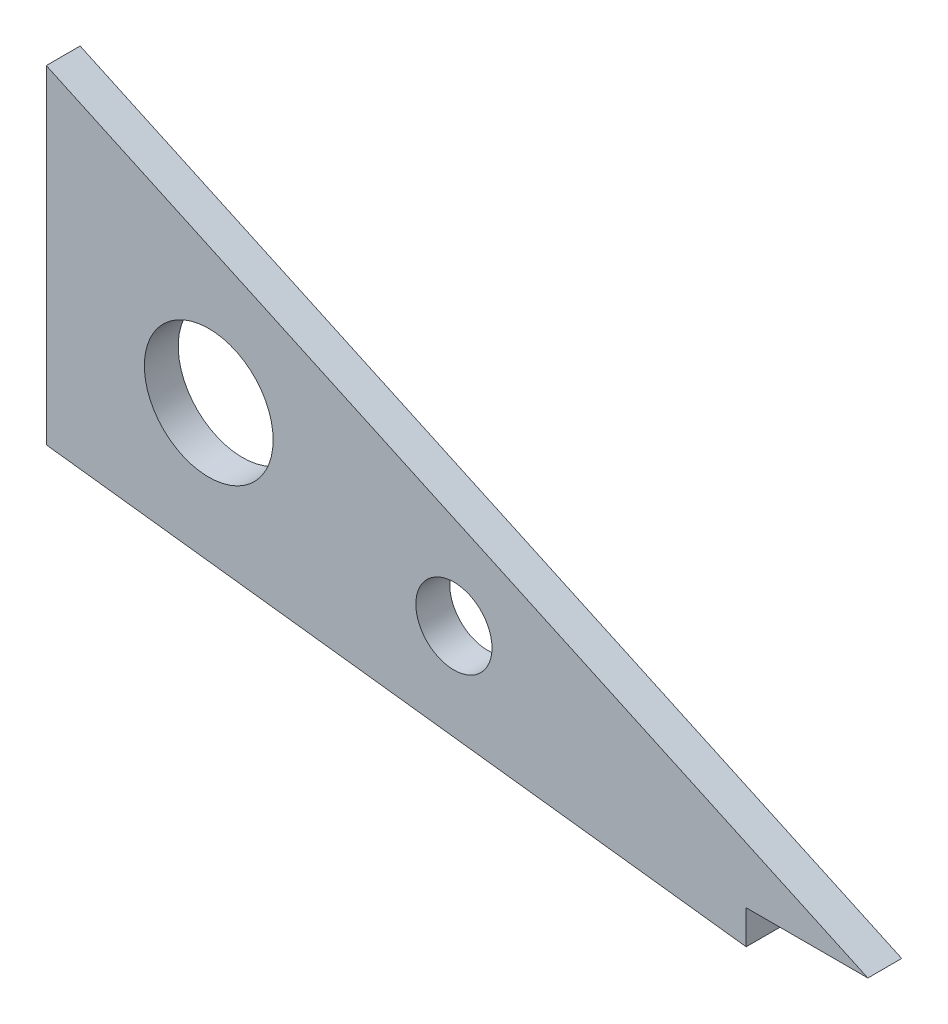
ISO-10303-21;
HEADER;
FILE_DESCRIPTION(('STEP AP214'),'2;1');
FILE_NAME('part.step','',(''),(''),'','','');
FILE_SCHEMA(('AUTOMOTIVE_DESIGN { 1 0 10303 214 1 1 1 1 }'));
ENDSEC;
DATA;
#1=APPLICATION_CONTEXT('core data for automotive mechanical design processes');
#2=APPLICATION_PROTOCOL_DEFINITION('international standard','automotive_design',2000,#1);
#3=PRODUCT_CONTEXT('',#1,'mechanical');
#4=PRODUCT('Part','Part','',(#3));
#5=PRODUCT_RELATED_PRODUCT_CATEGORY('part','',(#4));
#6=PRODUCT_DEFINITION_FORMATION('','',#4);
#7=PRODUCT_DEFINITION_CONTEXT('part definition',#1,'design');
#8=PRODUCT_DEFINITION('design','',#6,#7);
#9=PRODUCT_DEFINITION_SHAPE('','',#8);
#10=(LENGTH_UNIT() NAMED_UNIT(*) SI_UNIT(.MILLI.,.METRE.));
#11=(NAMED_UNIT(*) PLANE_ANGLE_UNIT() SI_UNIT($,.RADIAN.));
#12=(NAMED_UNIT(*) SI_UNIT($,.STERADIAN.) SOLID_ANGLE_UNIT());
#13=UNCERTAINTY_MEASURE_WITH_UNIT(LENGTH_MEASURE(1.E-05),#10,'distance_accuracy_value','');
#14=(GEOMETRIC_REPRESENTATION_CONTEXT(3) GLOBAL_UNCERTAINTY_ASSIGNED_CONTEXT((#13)) GLOBAL_UNIT_ASSIGNED_CONTEXT((#10,
#11,#12)) REPRESENTATION_CONTEXT('',''));
#15=CARTESIAN_POINT('',(0.,0.,0.));
#16=DIRECTION('',(0.,0.,1.));
#17=DIRECTION('',(1.,0.,0.));
#18=AXIS2_PLACEMENT_3D('',#15,#16,#17);
#19=CARTESIAN_POINT('',(0.,0.,2.));
#20=DIRECTION('',(0.,0.,1.));
#21=DIRECTION('',(1.,0.,0.));
#22=AXIS2_PLACEMENT_3D('',#19,#20,#21);
#23=PLANE('',#22);
#24=CARTESIAN_POINT('',(27.9785551008086,22.9070632910188,2.));
#25=DIRECTION('',(0.,0.,1.));
#26=DIRECTION('',(1.,0.,0.));
#27=AXIS2_PLACEMENT_3D('',#24,#25,#26);
#28=CIRCLE('',#27,3.804230181389);
#29=CARTESIAN_POINT('',(31.7827852821976,22.9070632910188,2.));
#30=VERTEX_POINT('',#29);
#31=EDGE_CURVE('E112',#30,#30,#28,.T.);
#32=ORIENTED_EDGE('',*,*,#31,.F.);
#33=EDGE_LOOP('',(#32));
#34=FACE_BOUND('',#33,.T.);
#35=DIRECTION('',(-0.907866673838739,0.419258992190965,0.));
#36=VECTOR('',#35,1.);
#37=CARTESIAN_POINT('',(18.3812223177325,35.3625936058513,2.));
#38=LINE('',#37,#36);
#39=CARTESIAN_POINT('',(66.9125575060626,12.9504936058513,2.));
#40=VERTEX_POINT('',#39);
#41=CARTESIAN_POINT('',(18.3812223177325,35.3625936058513,2.));
#42=VERTEX_POINT('',#41);
#43=EDGE_CURVE('E117',#40,#42,#38,.T.);
#44=ORIENTED_EDGE('',*,*,#43,.T.);
#45=DIRECTION('',(0.,-1.,0.));
#46=VECTOR('',#45,1.);
#47=CARTESIAN_POINT('',(18.3812223177325,35.3625936058513,2.));
#48=LINE('',#47,#46);
#49=CARTESIAN_POINT('',(18.3812223177325,15.9598936058514,2.));
#50=VERTEX_POINT('',#49);
#51=EDGE_CURVE('E84',#42,#50,#48,.T.);
#52=ORIENTED_EDGE('',*,*,#51,.T.);
#53=DIRECTION('',(0.992738748127803,-0.120290390163317,0.));
#54=VECTOR('',#53,1.);
#55=CARTESIAN_POINT('',(18.3812223177325,15.9598936058514,2.));
#56=LINE('',#55,#54);
#57=CARTESIAN_POINT('',(59.7230575060636,10.9504936058509,2.));
#58=VERTEX_POINT('',#57);
#59=EDGE_CURVE('E88',#50,#58,#56,.T.);
#60=ORIENTED_EDGE('',*,*,#59,.T.);
#61=DIRECTION('',(0.,1.,0.));
#62=VECTOR('',#61,1.);
#63=CARTESIAN_POINT('',(59.7230575060636,10.9504936058509,2.));
#64=LINE('',#63,#62);
#65=CARTESIAN_POINT('',(59.7230575060636,12.9504936058513,2.));
#66=VERTEX_POINT('',#65);
#67=EDGE_CURVE('E92',#58,#66,#64,.T.);
#68=ORIENTED_EDGE('',*,*,#67,.T.);
#69=DIRECTION('',(1.,0.,0.));
#70=VECTOR('',#69,1.);
#71=CARTESIAN_POINT('',(59.7230575060636,12.9504936058513,2.));
#72=LINE('',#71,#70);
#73=EDGE_CURVE('E50',#66,#40,#72,.T.);
#74=ORIENTED_EDGE('',*,*,#73,.T.);
#75=EDGE_LOOP('',(#44,#52,#60,#68,#74));
#76=FACE_BOUND('',#75,.T.);
#77=CARTESIAN_POINT('',(42.4602729016075,18.7298037894143,2.));
#78=DIRECTION('',(0.,0.,1.));
#79=DIRECTION('',(1.,0.,0.));
#80=AXIS2_PLACEMENT_3D('',#77,#78,#79);
#81=CIRCLE('',#80,2.24992563442071);
#82=CARTESIAN_POINT('',(44.7101985360282,18.7298037894143,2.));
#83=VERTEX_POINT('',#82);
#84=EDGE_CURVE('E154',#83,#83,#81,.T.);
#85=ORIENTED_EDGE('',*,*,#84,.F.);
#86=EDGE_LOOP('',(#85));
#87=FACE_BOUND('',#86,.T.);
#88=ADVANCED_FACE('F33',(#34,#76,#87),#23,.T.);
#89=CARTESIAN_POINT('',(0.,0.,0.));
#90=DIRECTION('',(0.,0.,1.));
#91=DIRECTION('',(1.,0.,0.));
#92=AXIS2_PLACEMENT_3D('',#89,#90,#91);
#93=PLANE('',#92);
#94=DIRECTION('',(-0.907866673838739,0.419258992190965,0.));
#95=VECTOR('',#94,1.);
#96=CARTESIAN_POINT('',(18.3812223177325,35.3625936058513,0.));
#97=LINE('',#96,#95);
#98=CARTESIAN_POINT('',(66.9125575060626,12.9504936058513,0.));
#99=VERTEX_POINT('',#98);
#100=CARTESIAN_POINT('',(18.3812223177325,35.3625936058513,0.));
#101=VERTEX_POINT('',#100);
#102=EDGE_CURVE('E108',#99,#101,#97,.T.);
#103=ORIENTED_EDGE('',*,*,#102,.F.);
#104=DIRECTION('',(1.,0.,0.));
#105=VECTOR('',#104,1.);
#106=CARTESIAN_POINT('',(59.7230575060636,12.9504936058513,0.));
#107=LINE('',#106,#105);
#108=CARTESIAN_POINT('',(59.7230575060636,12.9504936058513,0.));
#109=VERTEX_POINT('',#108);
#110=EDGE_CURVE('E76',#109,#99,#107,.T.);
#111=ORIENTED_EDGE('',*,*,#110,.F.);
#112=DIRECTION('',(0.,1.,0.));
#113=VECTOR('',#112,1.);
#114=CARTESIAN_POINT('',(59.7230575060636,10.9504936058509,0.));
#115=LINE('',#114,#113);
#116=CARTESIAN_POINT('',(59.7230575060636,10.9504936058509,0.));
#117=VERTEX_POINT('',#116);
#118=EDGE_CURVE('E70',#117,#109,#115,.T.);
#119=ORIENTED_EDGE('',*,*,#118,.F.);
#120=DIRECTION('',(0.992738748127803,-0.120290390163317,0.));
#121=VECTOR('',#120,1.);
#122=CARTESIAN_POINT('',(18.3812223177325,15.9598936058514,0.));
#123=LINE('',#122,#121);
#124=CARTESIAN_POINT('',(18.3812223177325,15.9598936058514,0.));
#125=VERTEX_POINT('',#124);
#126=EDGE_CURVE('E99',#125,#117,#123,.T.);
#127=ORIENTED_EDGE('',*,*,#126,.F.);
#128=DIRECTION('',(0.,-1.,0.));
#129=VECTOR('',#128,1.);
#130=CARTESIAN_POINT('',(18.3812223177325,35.3625936058513,0.));
#131=LINE('',#130,#129);
#132=EDGE_CURVE('E111',#101,#125,#131,.T.);
#133=ORIENTED_EDGE('',*,*,#132,.F.);
#134=EDGE_LOOP('',(#103,#111,#119,#127,#133));
#135=FACE_BOUND('',#134,.T.);
#136=CARTESIAN_POINT('',(27.9785551008086,22.9070632910188,0.));
#137=DIRECTION('',(0.,0.,1.));
#138=DIRECTION('',(1.,0.,0.));
#139=AXIS2_PLACEMENT_3D('',#136,#137,#138);
#140=CIRCLE('',#139,3.804230181389);
#141=CARTESIAN_POINT('',(31.7827852821976,22.9070632910188,0.));
#142=VERTEX_POINT('',#141);
#143=EDGE_CURVE('E160',#142,#142,#140,.T.);
#144=ORIENTED_EDGE('',*,*,#143,.T.);
#145=EDGE_LOOP('',(#144));
#146=FACE_BOUND('',#145,.T.);
#147=CARTESIAN_POINT('',(42.4602729016075,18.7298037894143,0.));
#148=DIRECTION('',(0.,0.,1.));
#149=DIRECTION('',(1.,0.,0.));
#150=AXIS2_PLACEMENT_3D('',#147,#148,#149);
#151=CIRCLE('',#150,2.24992563442071);
#152=CARTESIAN_POINT('',(44.7101985360282,18.7298037894143,0.));
#153=VERTEX_POINT('',#152);
#154=EDGE_CURVE('E157',#153,#153,#151,.T.);
#155=ORIENTED_EDGE('',*,*,#154,.T.);
#156=EDGE_LOOP('',(#155));
#157=FACE_BOUND('',#156,.T.);
#158=ADVANCED_FACE('F121',(#135,#146,#157),#93,.F.);
#159=CARTESIAN_POINT('',(18.3812223177325,35.3625936058513,2.));
#160=DIRECTION('',(-0.419258992190965,-0.907866673838739,0.));
#161=DIRECTION('',(0.907866673838739,-0.419258992190965,0.));
#162=AXIS2_PLACEMENT_3D('',#159,#160,#161);
#163=PLANE('',#162);
#164=ORIENTED_EDGE('',*,*,#102,.T.);
#165=DIRECTION('',(0.,0.,-1.));
#166=VECTOR('',#165,1.);
#167=CARTESIAN_POINT('',(18.3812223177325,35.3625936058513,2.));
#168=LINE('',#167,#166);
#169=EDGE_CURVE('E11',#42,#101,#168,.T.);
#170=ORIENTED_EDGE('',*,*,#169,.F.);
#171=ORIENTED_EDGE('',*,*,#43,.F.);
#172=DIRECTION('',(0.,0.,-1.));
#173=VECTOR('',#172,1.);
#174=CARTESIAN_POINT('',(66.9125575060626,12.9504936058513,2.));
#175=LINE('',#174,#173);
#176=EDGE_CURVE('E104',#40,#99,#175,.T.);
#177=ORIENTED_EDGE('',*,*,#176,.T.);
#178=EDGE_LOOP('',(#164,#170,#171,#177));
#179=FACE_BOUND('',#178,.T.);
#180=ADVANCED_FACE('F35',(#179),#163,.F.);
#181=CARTESIAN_POINT('',(18.3812223177325,35.3625936058513,2.));
#182=DIRECTION('',(1.,0.,0.));
#183=DIRECTION('',(0.,0.,-1.));
#184=AXIS2_PLACEMENT_3D('',#181,#182,#183);
#185=PLANE('',#184);
#186=ORIENTED_EDGE('',*,*,#132,.T.);
#187=DIRECTION('',(0.,0.,-1.));
#188=VECTOR('',#187,1.);
#189=CARTESIAN_POINT('',(18.3812223177325,15.9598936058514,2.));
#190=LINE('',#189,#188);
#191=EDGE_CURVE('E42',#50,#125,#190,.T.);
#192=ORIENTED_EDGE('',*,*,#191,.F.);
#193=ORIENTED_EDGE('',*,*,#51,.F.);
#194=ORIENTED_EDGE('',*,*,#169,.T.);
#195=EDGE_LOOP('',(#186,#192,#193,#194));
#196=FACE_BOUND('',#195,.T.);
#197=ADVANCED_FACE('F192',(#196),#185,.F.);
#198=CARTESIAN_POINT('',(18.3812223177325,15.9598936058514,2.));
#199=DIRECTION('',(0.120290390163317,0.992738748127803,0.));
#200=DIRECTION('',(-0.992738748127803,0.120290390163317,0.));
#201=AXIS2_PLACEMENT_3D('',#198,#199,#200);
#202=PLANE('',#201);
#203=ORIENTED_EDGE('',*,*,#126,.T.);
#204=DIRECTION('',(0.,0.,-1.));
#205=VECTOR('',#204,1.);
#206=CARTESIAN_POINT('',(59.7230575060636,10.9504936058509,2.));
#207=LINE('',#206,#205);
#208=EDGE_CURVE('E96',#58,#117,#207,.T.);
#209=ORIENTED_EDGE('',*,*,#208,.F.);
#210=ORIENTED_EDGE('',*,*,#59,.F.);
#211=ORIENTED_EDGE('',*,*,#191,.T.);
#212=EDGE_LOOP('',(#203,#209,#210,#211));
#213=FACE_BOUND('',#212,.T.);
#214=ADVANCED_FACE('F97',(#213),#202,.F.);
#215=CARTESIAN_POINT('',(59.7230575060636,10.9504936058509,2.));
#216=DIRECTION('',(-1.,0.,0.));
#217=DIRECTION('',(0.,0.,1.));
#218=AXIS2_PLACEMENT_3D('',#215,#216,#217);
#219=PLANE('',#218);
#220=ORIENTED_EDGE('',*,*,#118,.T.);
#221=DIRECTION('',(0.,0.,-1.));
#222=VECTOR('',#221,1.);
#223=CARTESIAN_POINT('',(59.7230575060636,12.9504936058513,2.));
#224=LINE('',#223,#222);
#225=EDGE_CURVE('E100',#66,#109,#224,.T.);
#226=ORIENTED_EDGE('',*,*,#225,.F.);
#227=ORIENTED_EDGE('',*,*,#67,.F.);
#228=ORIENTED_EDGE('',*,*,#208,.T.);
#229=EDGE_LOOP('',(#220,#226,#227,#228));
#230=FACE_BOUND('',#229,.T.);
#231=ADVANCED_FACE('F102',(#230),#219,.F.);
#232=CARTESIAN_POINT('',(59.7230575060636,12.9504936058513,2.));
#233=DIRECTION('',(0.,1.,0.));
#234=DIRECTION('',(0.,0.,1.));
#235=AXIS2_PLACEMENT_3D('',#232,#233,#234);
#236=PLANE('',#235);
#237=ORIENTED_EDGE('',*,*,#110,.T.);
#238=ORIENTED_EDGE('',*,*,#176,.F.);
#239=ORIENTED_EDGE('',*,*,#73,.F.);
#240=ORIENTED_EDGE('',*,*,#225,.T.);
#241=EDGE_LOOP('',(#237,#238,#239,#240));
#242=FACE_BOUND('',#241,.T.);
#243=ADVANCED_FACE('F126',(#242),#236,.F.);
#244=CARTESIAN_POINT('',(27.9785551008086,22.9070632910188,2.));
#245=DIRECTION('',(0.,0.,-1.));
#246=DIRECTION('',(-1.,0.,0.));
#247=AXIS2_PLACEMENT_3D('',#244,#245,#246);
#248=CYLINDRICAL_SURFACE('',#247,3.804230181389);
#249=ORIENTED_EDGE('',*,*,#31,.T.);
#250=EDGE_LOOP('',(#249));
#251=FACE_BOUND('',#250,.T.);
#252=ORIENTED_EDGE('',*,*,#143,.F.);
#253=EDGE_LOOP('',(#252));
#254=FACE_BOUND('',#253,.T.);
#255=ADVANCED_FACE('F128',(#251,#254),#248,.F.);
#256=CARTESIAN_POINT('',(42.4602729016075,18.7298037894143,2.));
#257=DIRECTION('',(0.,0.,-1.));
#258=DIRECTION('',(-1.,0.,0.));
#259=AXIS2_PLACEMENT_3D('',#256,#257,#258);
#260=CYLINDRICAL_SURFACE('',#259,2.24992563442071);
#261=ORIENTED_EDGE('',*,*,#84,.T.);
#262=EDGE_LOOP('',(#261));
#263=FACE_BOUND('',#262,.T.);
#264=ORIENTED_EDGE('',*,*,#154,.F.);
#265=EDGE_LOOP('',(#264));
#266=FACE_BOUND('',#265,.T.);
#267=ADVANCED_FACE('F134',(#263,#266),#260,.F.);
#268=CLOSED_SHELL('',(#88,#158,#180,#197,#214,#231,#243,#255,#267));
#269=MANIFOLD_SOLID_BREP('B2',#268);
#270=ADVANCED_BREP_SHAPE_REPRESENTATION('',(#18,#269),#14);
#271=SHAPE_DEFINITION_REPRESENTATION(#9,#270);
ENDSEC;
END-ISO-10303-21;
